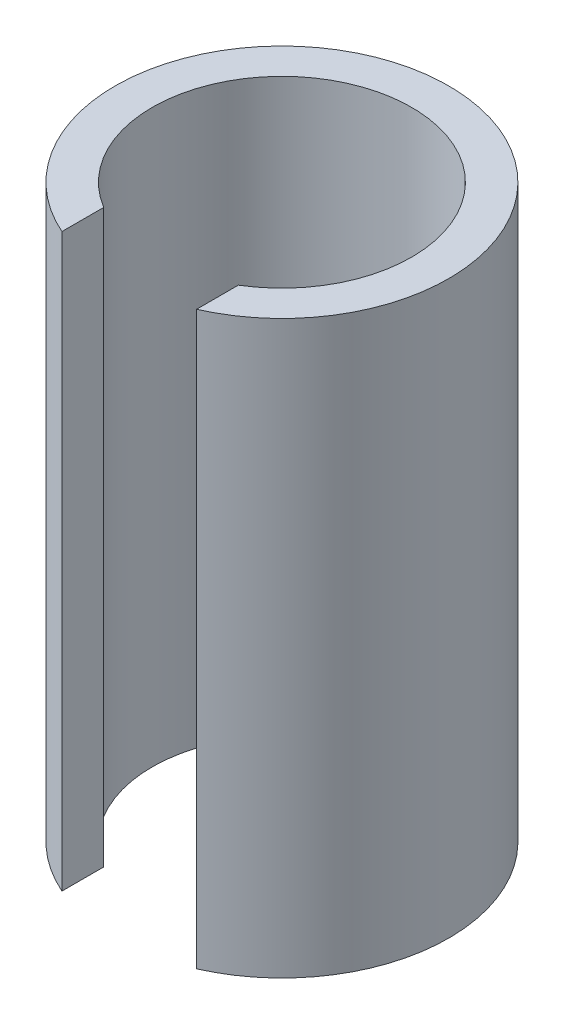
ISO-10303-21;
HEADER;
FILE_DESCRIPTION(('STEP AP214'),'2;1');
FILE_NAME('part.step','',(''),(''),'','','');
FILE_SCHEMA(('AUTOMOTIVE_DESIGN { 1 0 10303 214 1 1 1 1 }'));
ENDSEC;
DATA;
#1=APPLICATION_CONTEXT('core data for automotive mechanical design processes');
#2=APPLICATION_PROTOCOL_DEFINITION('international standard','automotive_design',2000,#1);
#3=PRODUCT_CONTEXT('',#1,'mechanical');
#4=PRODUCT('Part','Part','',(#3));
#5=PRODUCT_RELATED_PRODUCT_CATEGORY('part','',(#4));
#6=PRODUCT_DEFINITION_FORMATION('','',#4);
#7=PRODUCT_DEFINITION_CONTEXT('part definition',#1,'design');
#8=PRODUCT_DEFINITION('design','',#6,#7);
#9=PRODUCT_DEFINITION_SHAPE('','',#8);
#10=(LENGTH_UNIT() NAMED_UNIT(*) SI_UNIT(.MILLI.,.METRE.));
#11=(NAMED_UNIT(*) PLANE_ANGLE_UNIT() SI_UNIT($,.RADIAN.));
#12=(NAMED_UNIT(*) SI_UNIT($,.STERADIAN.) SOLID_ANGLE_UNIT());
#13=UNCERTAINTY_MEASURE_WITH_UNIT(LENGTH_MEASURE(1.E-05),#10,'distance_accuracy_value','');
#14=(GEOMETRIC_REPRESENTATION_CONTEXT(3) GLOBAL_UNCERTAINTY_ASSIGNED_CONTEXT((#13)) GLOBAL_UNIT_ASSIGNED_CONTEXT((#10,
#11,#12)) REPRESENTATION_CONTEXT('',''));
#15=CARTESIAN_POINT('',(0.,0.,0.));
#16=DIRECTION('',(0.,0.,1.));
#17=DIRECTION('',(1.,0.,0.));
#18=AXIS2_PLACEMENT_3D('',#15,#16,#17);
#19=CARTESIAN_POINT('',(0.,70.,0.));
#20=DIRECTION('',(0.,1.,0.));
#21=DIRECTION('',(0.,0.,1.));
#22=AXIS2_PLACEMENT_3D('',#19,#20,#21);
#23=PLANE('',#22);
#24=DIRECTION('',(0.,0.,1.));
#25=VECTOR('',#24,1.);
#26=CARTESIAN_POINT('',(-8.25,70.,11.6214136450918));
#27=LINE('',#26,#25);
#28=CARTESIAN_POINT('',(-8.25,70.,13.5921852547705));
#29=VERTEX_POINT('',#28);
#30=CARTESIAN_POINT('',(-8.25,70.,18.7120282171656));
#31=VERTEX_POINT('',#30);
#32=EDGE_CURVE('E90',#29,#31,#27,.T.);
#33=ORIENTED_EDGE('',*,*,#32,.F.);
#34=CARTESIAN_POINT('',(0.,70.,0.));
#35=DIRECTION('',(0.,1.,0.));
#36=DIRECTION('',(0.,0.,1.));
#37=AXIS2_PLACEMENT_3D('',#34,#35,#36);
#38=CIRCLE('',#37,15.9);
#39=CARTESIAN_POINT('',(8.25,70.,13.5921852547705));
#40=VERTEX_POINT('',#39);
#41=EDGE_CURVE('E99',#40,#29,#38,.T.);
#42=ORIENTED_EDGE('',*,*,#41,.F.);
#43=DIRECTION('',(0.,0.,-1.));
#44=VECTOR('',#43,1.);
#45=CARTESIAN_POINT('',(8.25,70.,11.6214136450918));
#46=LINE('',#45,#44);
#47=CARTESIAN_POINT('',(8.25,70.,18.7120282171656));
#48=VERTEX_POINT('',#47);
#49=EDGE_CURVE('E73',#48,#40,#46,.T.);
#50=ORIENTED_EDGE('',*,*,#49,.F.);
#51=CARTESIAN_POINT('',(0.,70.,0.));
#52=DIRECTION('',(0.,1.,0.));
#53=DIRECTION('',(0.,0.,1.));
#54=AXIS2_PLACEMENT_3D('',#51,#52,#53);
#55=CIRCLE('',#54,20.45);
#56=EDGE_CURVE('E101',#48,#31,#55,.T.);
#57=ORIENTED_EDGE('',*,*,#56,.T.);
#58=EDGE_LOOP('',(#33,#42,#50,#57));
#59=FACE_BOUND('',#58,.T.);
#60=ADVANCED_FACE('F50',(#59),#23,.T.);
#61=CARTESIAN_POINT('',(0.,0.,0.));
#62=DIRECTION('',(0.,1.,0.));
#63=DIRECTION('',(0.,0.,1.));
#64=AXIS2_PLACEMENT_3D('',#61,#62,#63);
#65=PLANE('',#64);
#66=CARTESIAN_POINT('',(0.,0.,0.));
#67=DIRECTION('',(0.,1.,0.));
#68=DIRECTION('',(0.,0.,1.));
#69=AXIS2_PLACEMENT_3D('',#66,#67,#68);
#70=CIRCLE('',#69,15.9);
#71=CARTESIAN_POINT('',(8.25,0.,13.5921852547705));
#72=VERTEX_POINT('',#71);
#73=CARTESIAN_POINT('',(-8.25,0.,13.5921852547705));
#74=VERTEX_POINT('',#73);
#75=EDGE_CURVE('E107',#72,#74,#70,.T.);
#76=ORIENTED_EDGE('',*,*,#75,.T.);
#77=DIRECTION('',(0.,0.,1.));
#78=VECTOR('',#77,1.);
#79=CARTESIAN_POINT('',(-8.25,0.,11.6214136450918));
#80=LINE('',#79,#78);
#81=CARTESIAN_POINT('',(-8.25,0.,18.7120282171656));
#82=VERTEX_POINT('',#81);
#83=EDGE_CURVE('E65',#74,#82,#80,.T.);
#84=ORIENTED_EDGE('',*,*,#83,.T.);
#85=CARTESIAN_POINT('',(0.,0.,0.));
#86=DIRECTION('',(0.,1.,0.));
#87=DIRECTION('',(0.,0.,1.));
#88=AXIS2_PLACEMENT_3D('',#85,#86,#87);
#89=CIRCLE('',#88,20.45);
#90=CARTESIAN_POINT('',(8.25,0.,18.7120282171656));
#91=VERTEX_POINT('',#90);
#92=EDGE_CURVE('E106',#91,#82,#89,.T.);
#93=ORIENTED_EDGE('',*,*,#92,.F.);
#94=DIRECTION('',(0.,0.,-1.));
#95=VECTOR('',#94,1.);
#96=CARTESIAN_POINT('',(8.25,0.,11.6214136450918));
#97=LINE('',#96,#95);
#98=EDGE_CURVE('E124',#91,#72,#97,.T.);
#99=ORIENTED_EDGE('',*,*,#98,.T.);
#100=EDGE_LOOP('',(#76,#84,#93,#99));
#101=FACE_BOUND('',#100,.T.);
#102=ADVANCED_FACE('F128',(#101),#65,.F.);
#103=CARTESIAN_POINT('',(0.,70.,0.));
#104=DIRECTION('',(0.,-1.,0.));
#105=DIRECTION('',(0.,0.,-1.));
#106=AXIS2_PLACEMENT_3D('',#103,#104,#105);
#107=CYLINDRICAL_SURFACE('',#106,20.45);
#108=ORIENTED_EDGE('',*,*,#92,.T.);
#109=DIRECTION('',(0.,-1.,0.));
#110=VECTOR('',#109,1.);
#111=CARTESIAN_POINT('',(-8.25,70.,18.7120282171656));
#112=LINE('',#111,#110);
#113=EDGE_CURVE('E115',#82,#31,#112,.F.);
#114=ORIENTED_EDGE('',*,*,#113,.T.);
#115=ORIENTED_EDGE('',*,*,#56,.F.);
#116=DIRECTION('',(0.,-1.,0.));
#117=VECTOR('',#116,1.);
#118=CARTESIAN_POINT('',(8.25,70.,18.7120282171656));
#119=LINE('',#118,#117);
#120=EDGE_CURVE('E130',#48,#91,#119,.T.);
#121=ORIENTED_EDGE('',*,*,#120,.T.);
#122=EDGE_LOOP('',(#108,#114,#115,#121));
#123=FACE_BOUND('',#122,.T.);
#124=ADVANCED_FACE('F52',(#123),#107,.T.);
#125=CARTESIAN_POINT('',(0.,70.,0.));
#126=DIRECTION('',(0.,-1.,0.));
#127=DIRECTION('',(0.,0.,-1.));
#128=AXIS2_PLACEMENT_3D('',#125,#126,#127);
#129=CYLINDRICAL_SURFACE('',#128,15.9);
#130=DIRECTION('',(0.,-1.,0.));
#131=VECTOR('',#130,1.);
#132=CARTESIAN_POINT('',(-8.25,70.,13.5921852547705));
#133=LINE('',#132,#131);
#134=EDGE_CURVE('E13',#74,#29,#133,.F.);
#135=ORIENTED_EDGE('',*,*,#134,.F.);
#136=ORIENTED_EDGE('',*,*,#75,.F.);
#137=DIRECTION('',(0.,-1.,0.));
#138=VECTOR('',#137,1.);
#139=CARTESIAN_POINT('',(8.25,70.,13.5921852547705));
#140=LINE('',#139,#138);
#141=EDGE_CURVE('E59',#40,#72,#140,.T.);
#142=ORIENTED_EDGE('',*,*,#141,.F.);
#143=ORIENTED_EDGE('',*,*,#41,.T.);
#144=EDGE_LOOP('',(#135,#136,#142,#143));
#145=FACE_BOUND('',#144,.T.);
#146=ADVANCED_FACE('F104',(#145),#129,.F.);
#147=CARTESIAN_POINT('',(8.25,0.,11.6214136450918));
#148=DIRECTION('',(1.,0.,0.));
#149=DIRECTION('',(0.,0.,-1.));
#150=AXIS2_PLACEMENT_3D('',#147,#148,#149);
#151=PLANE('',#150);
#152=ORIENTED_EDGE('',*,*,#49,.T.);
#153=ORIENTED_EDGE('',*,*,#141,.T.);
#154=ORIENTED_EDGE('',*,*,#98,.F.);
#155=ORIENTED_EDGE('',*,*,#120,.F.);
#156=EDGE_LOOP('',(#152,#153,#154,#155));
#157=FACE_BOUND('',#156,.T.);
#158=ADVANCED_FACE('F123',(#157),#151,.F.);
#159=CARTESIAN_POINT('',(-8.25,0.,11.6214136450918));
#160=DIRECTION('',(-1.,0.,0.));
#161=DIRECTION('',(0.,0.,1.));
#162=AXIS2_PLACEMENT_3D('',#159,#160,#161);
#163=PLANE('',#162);
#164=ORIENTED_EDGE('',*,*,#83,.F.);
#165=ORIENTED_EDGE('',*,*,#134,.T.);
#166=ORIENTED_EDGE('',*,*,#32,.T.);
#167=ORIENTED_EDGE('',*,*,#113,.F.);
#168=EDGE_LOOP('',(#164,#165,#166,#167));
#169=FACE_BOUND('',#168,.T.);
#170=ADVANCED_FACE('F89',(#169),#163,.F.);
#171=CLOSED_SHELL('',(#60,#102,#124,#146,#158,#170));
#172=MANIFOLD_SOLID_BREP('B2',#171);
#173=ADVANCED_BREP_SHAPE_REPRESENTATION('',(#18,#172),#14);
#174=SHAPE_DEFINITION_REPRESENTATION(#9,#173);
ENDSEC;
END-ISO-10303-21;
